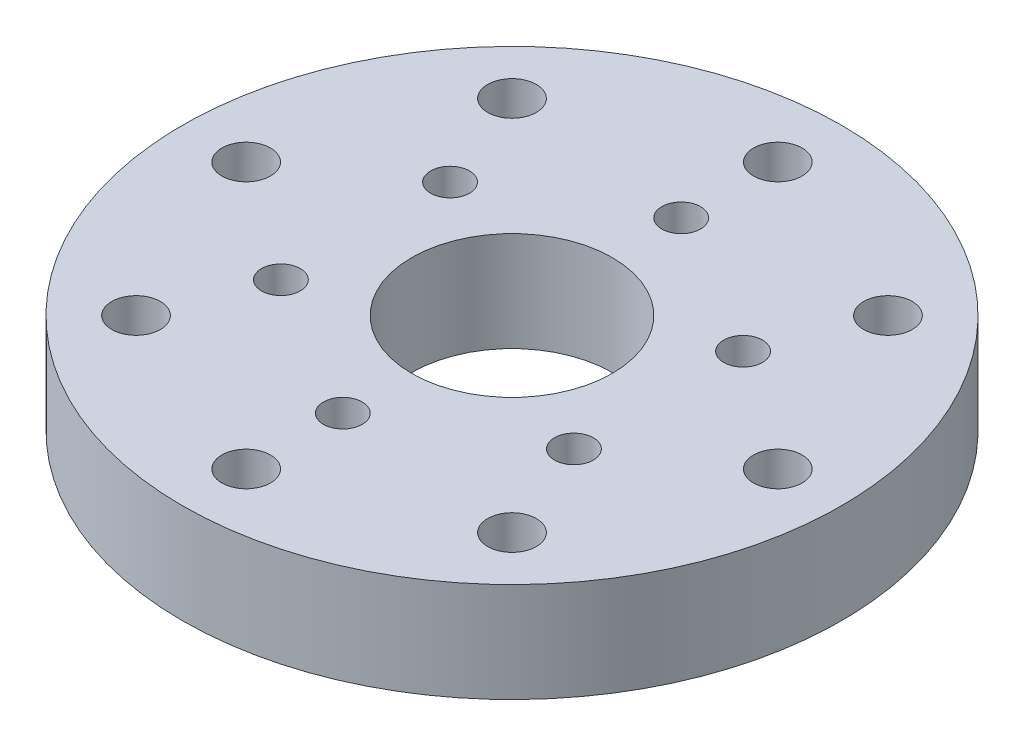
ISO-10303-21;
HEADER;
FILE_DESCRIPTION(('STEP AP214'),'2;1');
FILE_NAME('part.step','',(''),(''),'','','');
FILE_SCHEMA(('AUTOMOTIVE_DESIGN { 1 0 10303 214 1 1 1 1 }'));
ENDSEC;
DATA;
#1=APPLICATION_CONTEXT('core data for automotive mechanical design processes');
#2=APPLICATION_PROTOCOL_DEFINITION('international standard','automotive_design',2000,#1);
#3=PRODUCT_CONTEXT('',#1,'mechanical');
#4=PRODUCT('Part','Part','',(#3));
#5=PRODUCT_RELATED_PRODUCT_CATEGORY('part','',(#4));
#6=PRODUCT_DEFINITION_FORMATION('','',#4);
#7=PRODUCT_DEFINITION_CONTEXT('part definition',#1,'design');
#8=PRODUCT_DEFINITION('design','',#6,#7);
#9=PRODUCT_DEFINITION_SHAPE('','',#8);
#10=(LENGTH_UNIT() NAMED_UNIT(*) SI_UNIT(.MILLI.,.METRE.));
#11=(NAMED_UNIT(*) PLANE_ANGLE_UNIT() SI_UNIT($,.RADIAN.));
#12=(NAMED_UNIT(*) SI_UNIT($,.STERADIAN.) SOLID_ANGLE_UNIT());
#13=UNCERTAINTY_MEASURE_WITH_UNIT(LENGTH_MEASURE(1.E-05),#10,'distance_accuracy_value','');
#14=(GEOMETRIC_REPRESENTATION_CONTEXT(3) GLOBAL_UNCERTAINTY_ASSIGNED_CONTEXT((#13)) GLOBAL_UNIT_ASSIGNED_CONTEXT((#10,
#11,#12)) REPRESENTATION_CONTEXT('',''));
#15=CARTESIAN_POINT('',(0.,0.,0.));
#16=DIRECTION('',(0.,0.,1.));
#17=DIRECTION('',(1.,0.,0.));
#18=AXIS2_PLACEMENT_3D('',#15,#16,#17);
#19=CARTESIAN_POINT('',(0.,17.272,0.));
#20=DIRECTION('',(0.,1.,0.));
#21=DIRECTION('',(0.,0.,1.));
#22=AXIS2_PLACEMENT_3D('',#19,#20,#21);
#23=PLANE('',#22);
#24=CARTESIAN_POINT('',(46.101,17.272,-4.82882343606022E-13));
#25=DIRECTION('',(0.,1.,0.));
#26=DIRECTION('',(0.,0.,1.));
#27=AXIS2_PLACEMENT_3D('',#24,#25,#26);
#28=CIRCLE('',#27,4.2164);
#29=CARTESIAN_POINT('',(46.101,17.272,4.21639999999952));
#30=VERTEX_POINT('',#29);
#31=EDGE_CURVE('E118',#30,#30,#28,.F.);
#32=ORIENTED_EDGE('',*,*,#31,.T.);
#33=EDGE_LOOP('',(#32));
#34=FACE_BOUND('',#33,.T.);
#35=CARTESIAN_POINT('',(3.21921562404015E-13,17.272,46.101));
#36=DIRECTION('',(0.,1.,0.));
#37=DIRECTION('',(0.,0.,1.));
#38=AXIS2_PLACEMENT_3D('',#35,#36,#37);
#39=CIRCLE('',#38,4.2164);
#40=CARTESIAN_POINT('',(3.21921562404015E-13,17.272,50.3174));
#41=VERTEX_POINT('',#40);
#42=EDGE_CURVE('E106',#41,#41,#39,.F.);
#43=ORIENTED_EDGE('',*,*,#42,.T.);
#44=EDGE_LOOP('',(#43));
#45=FACE_BOUND('',#44,.T.);
#46=CARTESIAN_POINT('',(-46.101,17.272,1.60960781202007E-13));
#47=DIRECTION('',(0.,1.,0.));
#48=DIRECTION('',(0.,0.,1.));
#49=AXIS2_PLACEMENT_3D('',#46,#47,#48);
#50=CIRCLE('',#49,4.2164);
#51=CARTESIAN_POINT('',(-46.101,17.272,4.21640000000016));
#52=VERTEX_POINT('',#51);
#53=EDGE_CURVE('E94',#52,#52,#50,.F.);
#54=ORIENTED_EDGE('',*,*,#53,.T.);
#55=EDGE_LOOP('',(#54));
#56=FACE_BOUND('',#55,.T.);
#57=CARTESIAN_POINT('',(0.,17.272,-46.101));
#58=DIRECTION('',(0.,1.,0.));
#59=DIRECTION('',(0.,0.,1.));
#60=AXIS2_PLACEMENT_3D('',#57,#58,#59);
#61=CIRCLE('',#60,4.2164);
#62=CARTESIAN_POINT('',(0.,17.272,-41.8846));
#63=VERTEX_POINT('',#62);
#64=EDGE_CURVE('E82',#63,#63,#61,.F.);
#65=ORIENTED_EDGE('',*,*,#64,.T.);
#66=EDGE_LOOP('',(#65));
#67=FACE_BOUND('',#66,.T.);
#68=CARTESIAN_POINT('',(25.4065872708242,17.272,14.6684999999998));
#69=DIRECTION('',(0.,1.,0.));
#70=DIRECTION('',(0.,0.,1.));
#71=AXIS2_PLACEMENT_3D('',#68,#69,#70);
#72=CIRCLE('',#71,3.3655);
#73=CARTESIAN_POINT('',(25.4065872708242,17.272,18.0339999999998));
#74=VERTEX_POINT('',#73);
#75=EDGE_CURVE('E70',#74,#74,#72,.F.);
#76=ORIENTED_EDGE('',*,*,#75,.T.);
#77=EDGE_LOOP('',(#76));
#78=FACE_BOUND('',#77,.T.);
#79=CARTESIAN_POINT('',(-25.406587270824,17.272,14.6685000000001));
#80=DIRECTION('',(0.,1.,0.));
#81=DIRECTION('',(0.,0.,1.));
#82=AXIS2_PLACEMENT_3D('',#79,#80,#81);
#83=CIRCLE('',#82,3.3655);
#84=CARTESIAN_POINT('',(-25.406587270824,17.272,18.0340000000001));
#85=VERTEX_POINT('',#84);
#86=EDGE_CURVE('E58',#85,#85,#83,.F.);
#87=ORIENTED_EDGE('',*,*,#86,.T.);
#88=EDGE_LOOP('',(#87));
#89=FACE_BOUND('',#88,.T.);
#90=CARTESIAN_POINT('',(0.,17.272,-29.337));
#91=DIRECTION('',(0.,1.,0.));
#92=DIRECTION('',(0.,0.,1.));
#93=AXIS2_PLACEMENT_3D('',#90,#91,#92);
#94=CIRCLE('',#93,3.3655);
#95=CARTESIAN_POINT('',(0.,17.272,-25.9715));
#96=VERTEX_POINT('',#95);
#97=EDGE_CURVE('E46',#96,#96,#94,.F.);
#98=ORIENTED_EDGE('',*,*,#97,.T.);
#99=EDGE_LOOP('',(#98));
#100=FACE_BOUND('',#99,.T.);
#101=CARTESIAN_POINT('',(0.,17.272,0.));
#102=DIRECTION('',(0.,1.,0.));
#103=DIRECTION('',(0.,0.,1.));
#104=AXIS2_PLACEMENT_3D('',#101,#102,#103);
#105=CIRCLE('',#104,57.15);
#106=CARTESIAN_POINT('',(0.,17.272,57.15));
#107=VERTEX_POINT('',#106);
#108=EDGE_CURVE('E10',#107,#107,#105,.T.);
#109=ORIENTED_EDGE('',*,*,#108,.T.);
#110=EDGE_LOOP('',(#109));
#111=FACE_BOUND('',#110,.T.);
#112=CARTESIAN_POINT('',(0.,17.272,0.));
#113=DIRECTION('',(0.,1.,0.));
#114=DIRECTION('',(0.,0.,1.));
#115=AXIS2_PLACEMENT_3D('',#112,#113,#114);
#116=CIRCLE('',#115,17.399);
#117=CARTESIAN_POINT('',(0.,17.272,17.399));
#118=VERTEX_POINT('',#117);
#119=EDGE_CURVE('E39',#118,#118,#116,.F.);
#120=ORIENTED_EDGE('',*,*,#119,.T.);
#121=EDGE_LOOP('',(#120));
#122=FACE_BOUND('',#121,.T.);
#123=CARTESIAN_POINT('',(-25.4065872708241,17.272,-14.6684999999999));
#124=DIRECTION('',(0.,1.,0.));
#125=DIRECTION('',(0.,0.,1.));
#126=AXIS2_PLACEMENT_3D('',#123,#124,#125);
#127=CIRCLE('',#126,3.3655);
#128=CARTESIAN_POINT('',(-25.4065872708241,17.272,-11.3029999999999));
#129=VERTEX_POINT('',#128);
#130=EDGE_CURVE('E52',#129,#129,#127,.F.);
#131=ORIENTED_EDGE('',*,*,#130,.T.);
#132=EDGE_LOOP('',(#131));
#133=FACE_BOUND('',#132,.T.);
#134=CARTESIAN_POINT('',(2.04859176075282E-13,17.272,29.337));
#135=DIRECTION('',(0.,1.,0.));
#136=DIRECTION('',(0.,0.,1.));
#137=AXIS2_PLACEMENT_3D('',#134,#135,#136);
#138=CIRCLE('',#137,3.3655);
#139=CARTESIAN_POINT('',(2.04859176075282E-13,17.272,32.7025));
#140=VERTEX_POINT('',#139);
#141=EDGE_CURVE('E64',#140,#140,#138,.F.);
#142=ORIENTED_EDGE('',*,*,#141,.T.);
#143=EDGE_LOOP('',(#142));
#144=FACE_BOUND('',#143,.T.);
#145=CARTESIAN_POINT('',(25.4065872708239,17.272,-14.6685000000003));
#146=DIRECTION('',(0.,1.,0.));
#147=DIRECTION('',(0.,0.,1.));
#148=AXIS2_PLACEMENT_3D('',#145,#146,#147);
#149=CIRCLE('',#148,3.3655);
#150=CARTESIAN_POINT('',(25.4065872708239,17.272,-11.3030000000003));
#151=VERTEX_POINT('',#150);
#152=EDGE_CURVE('E76',#151,#151,#149,.F.);
#153=ORIENTED_EDGE('',*,*,#152,.T.);
#154=EDGE_LOOP('',(#153));
#155=FACE_BOUND('',#154,.T.);
#156=CARTESIAN_POINT('',(-32.5983297194811,17.272,-32.598329719481));
#157=DIRECTION('',(0.,1.,0.));
#158=DIRECTION('',(0.,0.,1.));
#159=AXIS2_PLACEMENT_3D('',#156,#157,#158);
#160=CIRCLE('',#159,4.2164);
#161=CARTESIAN_POINT('',(-32.5983297194811,17.272,-28.381929719481));
#162=VERTEX_POINT('',#161);
#163=EDGE_CURVE('E88',#162,#162,#160,.F.);
#164=ORIENTED_EDGE('',*,*,#163,.T.);
#165=EDGE_LOOP('',(#164));
#166=FACE_BOUND('',#165,.T.);
#167=CARTESIAN_POINT('',(-32.5983297194809,17.272,32.5983297194812));
#168=DIRECTION('',(0.,1.,0.));
#169=DIRECTION('',(0.,0.,1.));
#170=AXIS2_PLACEMENT_3D('',#167,#168,#169);
#171=CIRCLE('',#170,4.2164);
#172=CARTESIAN_POINT('',(-32.5983297194809,17.272,36.8147297194812));
#173=VERTEX_POINT('',#172);
#174=EDGE_CURVE('E100',#173,#173,#171,.F.);
#175=ORIENTED_EDGE('',*,*,#174,.T.);
#176=EDGE_LOOP('',(#175));
#177=FACE_BOUND('',#176,.T.);
#178=CARTESIAN_POINT('',(32.5983297194813,17.272,32.5983297194807));
#179=DIRECTION('',(0.,1.,0.));
#180=DIRECTION('',(0.,0.,1.));
#181=AXIS2_PLACEMENT_3D('',#178,#179,#180);
#182=CIRCLE('',#181,4.2164);
#183=CARTESIAN_POINT('',(32.5983297194813,17.272,36.8147297194807));
#184=VERTEX_POINT('',#183);
#185=EDGE_CURVE('E112',#184,#184,#182,.F.);
#186=ORIENTED_EDGE('',*,*,#185,.T.);
#187=EDGE_LOOP('',(#186));
#188=FACE_BOUND('',#187,.T.);
#189=CARTESIAN_POINT('',(32.5983297194806,17.272,-32.5983297194814));
#190=DIRECTION('',(0.,1.,0.));
#191=DIRECTION('',(0.,0.,1.));
#192=AXIS2_PLACEMENT_3D('',#189,#190,#191);
#193=CIRCLE('',#192,4.2164);
#194=CARTESIAN_POINT('',(32.5983297194806,17.272,-28.3819297194814));
#195=VERTEX_POINT('',#194);
#196=EDGE_CURVE('E124',#195,#195,#193,.F.);
#197=ORIENTED_EDGE('',*,*,#196,.T.);
#198=EDGE_LOOP('',(#197));
#199=FACE_BOUND('',#198,.T.);
#200=ADVANCED_FACE('F28',(#34,#45,#56,#67,#78,#89,#100,#111,#122,#133,#144,#155,#166,#177,#188,
#199),#23,.T.);
#201=CARTESIAN_POINT('',(0.,0.,0.));
#202=DIRECTION('',(0.,1.,0.));
#203=DIRECTION('',(0.,0.,1.));
#204=AXIS2_PLACEMENT_3D('',#201,#202,#203);
#205=PLANE('',#204);
#206=CARTESIAN_POINT('',(46.101,0.,-4.82882343606022E-13));
#207=DIRECTION('',(0.,1.,0.));
#208=DIRECTION('',(-1.,0.,0.));
#209=AXIS2_PLACEMENT_3D('',#206,#207,#208);
#210=CIRCLE('',#209,4.2164);
#211=CARTESIAN_POINT('',(41.8846,0.,-4.38717897854727E-13));
#212=VERTEX_POINT('',#211);
#213=EDGE_CURVE('E121',#212,#212,#210,.T.);
#214=ORIENTED_EDGE('',*,*,#213,.T.);
#215=EDGE_LOOP('',(#214));
#216=FACE_BOUND('',#215,.T.);
#217=CARTESIAN_POINT('',(3.21921562404015E-13,0.,46.101));
#218=DIRECTION('',(0.,1.,0.));
#219=DIRECTION('',(0.,0.,-1.));
#220=AXIS2_PLACEMENT_3D('',#217,#218,#219);
#221=CIRCLE('',#220,4.2164);
#222=CARTESIAN_POINT('',(2.92478598569818E-13,0.,41.8846));
#223=VERTEX_POINT('',#222);
#224=EDGE_CURVE('E109',#223,#223,#221,.T.);
#225=ORIENTED_EDGE('',*,*,#224,.T.);
#226=EDGE_LOOP('',(#225));
#227=FACE_BOUND('',#226,.T.);
#228=CARTESIAN_POINT('',(-46.101,0.,1.60960781202007E-13));
#229=DIRECTION('',(0.,1.,0.));
#230=DIRECTION('',(1.,0.,0.));
#231=AXIS2_PLACEMENT_3D('',#228,#229,#230);
#232=CIRCLE('',#231,4.2164);
#233=CARTESIAN_POINT('',(-41.8846,0.,1.46239299284909E-13));
#234=VERTEX_POINT('',#233);
#235=EDGE_CURVE('E97',#234,#234,#232,.T.);
#236=ORIENTED_EDGE('',*,*,#235,.T.);
#237=EDGE_LOOP('',(#236));
#238=FACE_BOUND('',#237,.T.);
#239=CARTESIAN_POINT('',(0.,0.,-46.101));
#240=DIRECTION('',(0.,1.,0.));
#241=DIRECTION('',(0.,0.,1.));
#242=AXIS2_PLACEMENT_3D('',#239,#240,#241);
#243=CIRCLE('',#242,4.2164);
#244=CARTESIAN_POINT('',(0.,0.,-41.8846));
#245=VERTEX_POINT('',#244);
#246=EDGE_CURVE('E85',#245,#245,#243,.T.);
#247=ORIENTED_EDGE('',*,*,#246,.T.);
#248=EDGE_LOOP('',(#247));
#249=FACE_BOUND('',#248,.T.);
#250=CARTESIAN_POINT('',(25.4065872708242,0.,14.6684999999998));
#251=DIRECTION('',(0.,1.,0.));
#252=DIRECTION('',(-0.866025403784443,0.,-0.499999999999992));
#253=AXIS2_PLACEMENT_3D('',#250,#251,#252);
#254=CIRCLE('',#253,3.3655);
#255=CARTESIAN_POINT('',(22.4919787743877,0.,12.9857499999998));
#256=VERTEX_POINT('',#255);
#257=EDGE_CURVE('E73',#256,#256,#254,.T.);
#258=ORIENTED_EDGE('',*,*,#257,.T.);
#259=EDGE_LOOP('',(#258));
#260=FACE_BOUND('',#259,.T.);
#261=CARTESIAN_POINT('',(-25.406587270824,0.,14.6685000000001));
#262=DIRECTION('',(0.,1.,0.));
#263=DIRECTION('',(0.866025403784436,0.,-0.500000000000004));
#264=AXIS2_PLACEMENT_3D('',#261,#262,#263);
#265=CIRCLE('',#264,3.3655);
#266=CARTESIAN_POINT('',(-22.4919787743875,0.,12.9857500000001));
#267=VERTEX_POINT('',#266);
#268=EDGE_CURVE('E61',#267,#267,#265,.T.);
#269=ORIENTED_EDGE('',*,*,#268,.T.);
#270=EDGE_LOOP('',(#269));
#271=FACE_BOUND('',#270,.T.);
#272=CARTESIAN_POINT('',(0.,0.,-29.337));
#273=DIRECTION('',(0.,1.,0.));
#274=DIRECTION('',(0.,0.,1.));
#275=AXIS2_PLACEMENT_3D('',#272,#273,#274);
#276=CIRCLE('',#275,3.3655);
#277=CARTESIAN_POINT('',(0.,0.,-25.9715));
#278=VERTEX_POINT('',#277);
#279=EDGE_CURVE('E49',#278,#278,#276,.T.);
#280=ORIENTED_EDGE('',*,*,#279,.T.);
#281=EDGE_LOOP('',(#280));
#282=FACE_BOUND('',#281,.T.);
#283=CARTESIAN_POINT('',(0.,0.,0.));
#284=DIRECTION('',(0.,1.,0.));
#285=DIRECTION('',(0.,0.,1.));
#286=AXIS2_PLACEMENT_3D('',#283,#284,#285);
#287=CIRCLE('',#286,57.15);
#288=CARTESIAN_POINT('',(0.,0.,57.15));
#289=VERTEX_POINT('',#288);
#290=EDGE_CURVE('E32',#289,#289,#287,.T.);
#291=ORIENTED_EDGE('',*,*,#290,.F.);
#292=EDGE_LOOP('',(#291));
#293=FACE_BOUND('',#292,.T.);
#294=CARTESIAN_POINT('',(0.,0.,0.));
#295=DIRECTION('',(0.,1.,0.));
#296=DIRECTION('',(0.,0.,1.));
#297=AXIS2_PLACEMENT_3D('',#294,#295,#296);
#298=CIRCLE('',#297,17.399);
#299=CARTESIAN_POINT('',(0.,0.,17.399));
#300=VERTEX_POINT('',#299);
#301=EDGE_CURVE('E43',#300,#300,#298,.T.);
#302=ORIENTED_EDGE('',*,*,#301,.T.);
#303=EDGE_LOOP('',(#302));
#304=FACE_BOUND('',#303,.T.);
#305=CARTESIAN_POINT('',(-25.4065872708241,0.,-14.6684999999999));
#306=DIRECTION('',(0.,1.,0.));
#307=DIRECTION('',(0.86602540378444,0.,0.499999999999998));
#308=AXIS2_PLACEMENT_3D('',#305,#306,#307);
#309=CIRCLE('',#308,3.3655);
#310=CARTESIAN_POINT('',(-22.4919787743876,0.,-12.9857499999999));
#311=VERTEX_POINT('',#310);
#312=EDGE_CURVE('E55',#311,#311,#309,.T.);
#313=ORIENTED_EDGE('',*,*,#312,.T.);
#314=EDGE_LOOP('',(#313));
#315=FACE_BOUND('',#314,.T.);
#316=CARTESIAN_POINT('',(2.04859176075282E-13,0.,29.337));
#317=DIRECTION('',(0.,1.,0.));
#318=DIRECTION('',(0.,0.,-1.));
#319=AXIS2_PLACEMENT_3D('',#316,#317,#318);
#320=CIRCLE('',#319,3.3655);
#321=CARTESIAN_POINT('',(1.81358015183529E-13,0.,25.9715));
#322=VERTEX_POINT('',#321);
#323=EDGE_CURVE('E67',#322,#322,#320,.T.);
#324=ORIENTED_EDGE('',*,*,#323,.T.);
#325=EDGE_LOOP('',(#324));
#326=FACE_BOUND('',#325,.T.);
#327=CARTESIAN_POINT('',(25.4065872708239,0.,-14.6685000000003));
#328=DIRECTION('',(0.,1.,0.));
#329=DIRECTION('',(-0.866025403784433,0.,0.50000000000001));
#330=AXIS2_PLACEMENT_3D('',#327,#328,#329);
#331=CIRCLE('',#330,3.3655);
#332=CARTESIAN_POINT('',(22.4919787743874,0.,-12.9857500000003));
#333=VERTEX_POINT('',#332);
#334=EDGE_CURVE('E79',#333,#333,#331,.T.);
#335=ORIENTED_EDGE('',*,*,#334,.T.);
#336=EDGE_LOOP('',(#335));
#337=FACE_BOUND('',#336,.T.);
#338=CARTESIAN_POINT('',(-32.5983297194811,0.,-32.598329719481));
#339=DIRECTION('',(0.,1.,0.));
#340=DIRECTION('',(0.707106781186549,0.,0.707106781186546));
#341=AXIS2_PLACEMENT_3D('',#338,#339,#340);
#342=CIRCLE('',#341,4.2164);
#343=CARTESIAN_POINT('',(-29.6168846872861,0.,-29.616884687286));
#344=VERTEX_POINT('',#343);
#345=EDGE_CURVE('E91',#344,#344,#342,.T.);
#346=ORIENTED_EDGE('',*,*,#345,.T.);
#347=EDGE_LOOP('',(#346));
#348=FACE_BOUND('',#347,.T.);
#349=CARTESIAN_POINT('',(-32.5983297194809,0.,32.5983297194812));
#350=DIRECTION('',(0.,1.,0.));
#351=DIRECTION('',(0.707106781186544,0.,-0.707106781186551));
#352=AXIS2_PLACEMENT_3D('',#349,#350,#351);
#353=CIRCLE('',#352,4.2164);
#354=CARTESIAN_POINT('',(-29.6168846872859,0.,29.6168846872862));
#355=VERTEX_POINT('',#354);
#356=EDGE_CURVE('E103',#355,#355,#353,.T.);
#357=ORIENTED_EDGE('',*,*,#356,.T.);
#358=EDGE_LOOP('',(#357));
#359=FACE_BOUND('',#358,.T.);
#360=CARTESIAN_POINT('',(32.5983297194813,0.,32.5983297194807));
#361=DIRECTION('',(0.,1.,0.));
#362=DIRECTION('',(-0.707106781186554,0.,-0.707106781186541));
#363=AXIS2_PLACEMENT_3D('',#360,#361,#362);
#364=CIRCLE('',#363,4.2164);
#365=CARTESIAN_POINT('',(29.6168846872863,0.,29.6168846872858));
#366=VERTEX_POINT('',#365);
#367=EDGE_CURVE('E115',#366,#366,#364,.T.);
#368=ORIENTED_EDGE('',*,*,#367,.T.);
#369=EDGE_LOOP('',(#368));
#370=FACE_BOUND('',#369,.T.);
#371=CARTESIAN_POINT('',(32.5983297194806,0.,-32.5983297194814));
#372=DIRECTION('',(0.,1.,0.));
#373=DIRECTION('',(-0.707106781186539,0.,0.707106781186556));
#374=AXIS2_PLACEMENT_3D('',#371,#372,#373);
#375=CIRCLE('',#374,4.2164);
#376=CARTESIAN_POINT('',(29.6168846872857,0.,-29.6168846872864));
#377=VERTEX_POINT('',#376);
#378=EDGE_CURVE('E127',#377,#377,#375,.T.);
#379=ORIENTED_EDGE('',*,*,#378,.T.);
#380=EDGE_LOOP('',(#379));
#381=FACE_BOUND('',#380,.T.);
#382=ADVANCED_FACE('F131',(#216,#227,#238,#249,#260,#271,#282,#293,#304,#315,#326,#337,#348,
#359,#370,#381),#205,.F.);
#383=CARTESIAN_POINT('',(0.,17.272,0.));
#384=DIRECTION('',(0.,-1.,0.));
#385=DIRECTION('',(0.,0.,-1.));
#386=AXIS2_PLACEMENT_3D('',#383,#384,#385);
#387=CYLINDRICAL_SURFACE('',#386,57.15);
#388=ORIENTED_EDGE('',*,*,#108,.F.);
#389=EDGE_LOOP('',(#388));
#390=FACE_BOUND('',#389,.T.);
#391=ORIENTED_EDGE('',*,*,#290,.T.);
#392=EDGE_LOOP('',(#391));
#393=FACE_BOUND('',#392,.T.);
#394=ADVANCED_FACE('F30',(#390,#393),#387,.T.);
#395=CARTESIAN_POINT('',(0.,22.352,0.));
#396=DIRECTION('',(0.,-1.,0.));
#397=DIRECTION('',(0.,0.,-1.));
#398=AXIS2_PLACEMENT_3D('',#395,#396,#397);
#399=CYLINDRICAL_SURFACE('',#398,17.399);
#400=ORIENTED_EDGE('',*,*,#119,.F.);
#401=EDGE_LOOP('',(#400));
#402=FACE_BOUND('',#401,.T.);
#403=ORIENTED_EDGE('',*,*,#301,.F.);
#404=EDGE_LOOP('',(#403));
#405=FACE_BOUND('',#404,.T.);
#406=ADVANCED_FACE('F154',(#402,#405),#399,.F.);
#407=CARTESIAN_POINT('',(0.,22.352,-29.337));
#408=DIRECTION('',(0.,-1.,0.));
#409=DIRECTION('',(0.,0.,-1.));
#410=AXIS2_PLACEMENT_3D('',#407,#408,#409);
#411=CYLINDRICAL_SURFACE('',#410,3.3655);
#412=ORIENTED_EDGE('',*,*,#97,.F.);
#413=EDGE_LOOP('',(#412));
#414=FACE_BOUND('',#413,.T.);
#415=ORIENTED_EDGE('',*,*,#279,.F.);
#416=EDGE_LOOP('',(#415));
#417=FACE_BOUND('',#416,.T.);
#418=ADVANCED_FACE('F157',(#414,#417),#411,.F.);
#419=CARTESIAN_POINT('',(-25.4065872708241,22.352,-14.6684999999999));
#420=DIRECTION('',(0.,-1.,0.));
#421=DIRECTION('',(0.,0.,-1.));
#422=AXIS2_PLACEMENT_3D('',#419,#420,#421);
#423=CYLINDRICAL_SURFACE('',#422,3.3655);
#424=ORIENTED_EDGE('',*,*,#130,.F.);
#425=EDGE_LOOP('',(#424));
#426=FACE_BOUND('',#425,.T.);
#427=ORIENTED_EDGE('',*,*,#312,.F.);
#428=EDGE_LOOP('',(#427));
#429=FACE_BOUND('',#428,.T.);
#430=ADVANCED_FACE('F161',(#426,#429),#423,.F.);
#431=CARTESIAN_POINT('',(-25.406587270824,22.352,14.6685000000001));
#432=DIRECTION('',(0.,-1.,0.));
#433=DIRECTION('',(0.,0.,-1.));
#434=AXIS2_PLACEMENT_3D('',#431,#432,#433);
#435=CYLINDRICAL_SURFACE('',#434,3.3655);
#436=ORIENTED_EDGE('',*,*,#86,.F.);
#437=EDGE_LOOP('',(#436));
#438=FACE_BOUND('',#437,.T.);
#439=ORIENTED_EDGE('',*,*,#268,.F.);
#440=EDGE_LOOP('',(#439));
#441=FACE_BOUND('',#440,.T.);
#442=ADVANCED_FACE('F165',(#438,#441),#435,.F.);
#443=CARTESIAN_POINT('',(2.04859176075282E-13,22.352,29.337));
#444=DIRECTION('',(0.,-1.,0.));
#445=DIRECTION('',(0.,0.,-1.));
#446=AXIS2_PLACEMENT_3D('',#443,#444,#445);
#447=CYLINDRICAL_SURFACE('',#446,3.3655);
#448=ORIENTED_EDGE('',*,*,#141,.F.);
#449=EDGE_LOOP('',(#448));
#450=FACE_BOUND('',#449,.T.);
#451=ORIENTED_EDGE('',*,*,#323,.F.);
#452=EDGE_LOOP('',(#451));
#453=FACE_BOUND('',#452,.T.);
#454=ADVANCED_FACE('F169',(#450,#453),#447,.F.);
#455=CARTESIAN_POINT('',(25.4065872708242,22.352,14.6684999999998));
#456=DIRECTION('',(0.,-1.,0.));
#457=DIRECTION('',(0.,0.,-1.));
#458=AXIS2_PLACEMENT_3D('',#455,#456,#457);
#459=CYLINDRICAL_SURFACE('',#458,3.3655);
#460=ORIENTED_EDGE('',*,*,#75,.F.);
#461=EDGE_LOOP('',(#460));
#462=FACE_BOUND('',#461,.T.);
#463=ORIENTED_EDGE('',*,*,#257,.F.);
#464=EDGE_LOOP('',(#463));
#465=FACE_BOUND('',#464,.T.);
#466=ADVANCED_FACE('F173',(#462,#465),#459,.F.);
#467=CARTESIAN_POINT('',(25.4065872708239,22.352,-14.6685000000003));
#468=DIRECTION('',(0.,-1.,0.));
#469=DIRECTION('',(0.,0.,-1.));
#470=AXIS2_PLACEMENT_3D('',#467,#468,#469);
#471=CYLINDRICAL_SURFACE('',#470,3.3655);
#472=ORIENTED_EDGE('',*,*,#152,.F.);
#473=EDGE_LOOP('',(#472));
#474=FACE_BOUND('',#473,.T.);
#475=ORIENTED_EDGE('',*,*,#334,.F.);
#476=EDGE_LOOP('',(#475));
#477=FACE_BOUND('',#476,.T.);
#478=ADVANCED_FACE('F177',(#474,#477),#471,.F.);
#479=CARTESIAN_POINT('',(0.,22.352,-46.101));
#480=DIRECTION('',(0.,-1.,0.));
#481=DIRECTION('',(0.,0.,-1.));
#482=AXIS2_PLACEMENT_3D('',#479,#480,#481);
#483=CYLINDRICAL_SURFACE('',#482,4.2164);
#484=ORIENTED_EDGE('',*,*,#64,.F.);
#485=EDGE_LOOP('',(#484));
#486=FACE_BOUND('',#485,.T.);
#487=ORIENTED_EDGE('',*,*,#246,.F.);
#488=EDGE_LOOP('',(#487));
#489=FACE_BOUND('',#488,.T.);
#490=ADVANCED_FACE('F181',(#486,#489),#483,.F.);
#491=CARTESIAN_POINT('',(-32.5983297194811,22.352,-32.598329719481));
#492=DIRECTION('',(0.,-1.,0.));
#493=DIRECTION('',(0.,0.,-1.));
#494=AXIS2_PLACEMENT_3D('',#491,#492,#493);
#495=CYLINDRICAL_SURFACE('',#494,4.2164);
#496=ORIENTED_EDGE('',*,*,#163,.F.);
#497=EDGE_LOOP('',(#496));
#498=FACE_BOUND('',#497,.T.);
#499=ORIENTED_EDGE('',*,*,#345,.F.);
#500=EDGE_LOOP('',(#499));
#501=FACE_BOUND('',#500,.T.);
#502=ADVANCED_FACE('F185',(#498,#501),#495,.F.);
#503=CARTESIAN_POINT('',(-46.101,22.352,1.60960781202007E-13));
#504=DIRECTION('',(0.,-1.,0.));
#505=DIRECTION('',(0.,0.,-1.));
#506=AXIS2_PLACEMENT_3D('',#503,#504,#505);
#507=CYLINDRICAL_SURFACE('',#506,4.2164);
#508=ORIENTED_EDGE('',*,*,#53,.F.);
#509=EDGE_LOOP('',(#508));
#510=FACE_BOUND('',#509,.T.);
#511=ORIENTED_EDGE('',*,*,#235,.F.);
#512=EDGE_LOOP('',(#511));
#513=FACE_BOUND('',#512,.T.);
#514=ADVANCED_FACE('F189',(#510,#513),#507,.F.);
#515=CARTESIAN_POINT('',(-32.5983297194809,22.352,32.5983297194812));
#516=DIRECTION('',(0.,-1.,0.));
#517=DIRECTION('',(0.,0.,-1.));
#518=AXIS2_PLACEMENT_3D('',#515,#516,#517);
#519=CYLINDRICAL_SURFACE('',#518,4.2164);
#520=ORIENTED_EDGE('',*,*,#174,.F.);
#521=EDGE_LOOP('',(#520));
#522=FACE_BOUND('',#521,.T.);
#523=ORIENTED_EDGE('',*,*,#356,.F.);
#524=EDGE_LOOP('',(#523));
#525=FACE_BOUND('',#524,.T.);
#526=ADVANCED_FACE('F193',(#522,#525),#519,.F.);
#527=CARTESIAN_POINT('',(3.21921562404015E-13,22.352,46.101));
#528=DIRECTION('',(0.,-1.,0.));
#529=DIRECTION('',(0.,0.,-1.));
#530=AXIS2_PLACEMENT_3D('',#527,#528,#529);
#531=CYLINDRICAL_SURFACE('',#530,4.2164);
#532=ORIENTED_EDGE('',*,*,#42,.F.);
#533=EDGE_LOOP('',(#532));
#534=FACE_BOUND('',#533,.T.);
#535=ORIENTED_EDGE('',*,*,#224,.F.);
#536=EDGE_LOOP('',(#535));
#537=FACE_BOUND('',#536,.T.);
#538=ADVANCED_FACE('F197',(#534,#537),#531,.F.);
#539=CARTESIAN_POINT('',(32.5983297194813,22.352,32.5983297194807));
#540=DIRECTION('',(0.,-1.,0.));
#541=DIRECTION('',(0.,0.,-1.));
#542=AXIS2_PLACEMENT_3D('',#539,#540,#541);
#543=CYLINDRICAL_SURFACE('',#542,4.2164);
#544=ORIENTED_EDGE('',*,*,#185,.F.);
#545=EDGE_LOOP('',(#544));
#546=FACE_BOUND('',#545,.T.);
#547=ORIENTED_EDGE('',*,*,#367,.F.);
#548=EDGE_LOOP('',(#547));
#549=FACE_BOUND('',#548,.T.);
#550=ADVANCED_FACE('F141',(#546,#549),#543,.F.);
#551=CARTESIAN_POINT('',(46.101,22.352,-4.82882343606022E-13));
#552=DIRECTION('',(0.,-1.,0.));
#553=DIRECTION('',(0.,0.,-1.));
#554=AXIS2_PLACEMENT_3D('',#551,#552,#553);
#555=CYLINDRICAL_SURFACE('',#554,4.2164);
#556=ORIENTED_EDGE('',*,*,#31,.F.);
#557=EDGE_LOOP('',(#556));
#558=FACE_BOUND('',#557,.T.);
#559=ORIENTED_EDGE('',*,*,#213,.F.);
#560=EDGE_LOOP('',(#559));
#561=FACE_BOUND('',#560,.T.);
#562=ADVANCED_FACE('F135',(#558,#561),#555,.F.);
#563=CARTESIAN_POINT('',(32.5983297194806,22.352,-32.5983297194814));
#564=DIRECTION('',(0.,-1.,0.));
#565=DIRECTION('',(0.,0.,-1.));
#566=AXIS2_PLACEMENT_3D('',#563,#564,#565);
#567=CYLINDRICAL_SURFACE('',#566,4.2164);
#568=ORIENTED_EDGE('',*,*,#196,.F.);
#569=EDGE_LOOP('',(#568));
#570=FACE_BOUND('',#569,.T.);
#571=ORIENTED_EDGE('',*,*,#378,.F.);
#572=EDGE_LOOP('',(#571));
#573=FACE_BOUND('',#572,.T.);
#574=ADVANCED_FACE('F133',(#570,#573),#567,.F.);
#575=CLOSED_SHELL('',(#200,#382,#394,#406,#418,#430,#442,#454,#466,#478,#490,#502,#514,#526,
#538,#550,#562,#574));
#576=MANIFOLD_SOLID_BREP('B2',#575);
#577=ADVANCED_BREP_SHAPE_REPRESENTATION('',(#18,#576),#14);
#578=SHAPE_DEFINITION_REPRESENTATION(#9,#577);
ENDSEC;
END-ISO-10303-21;
